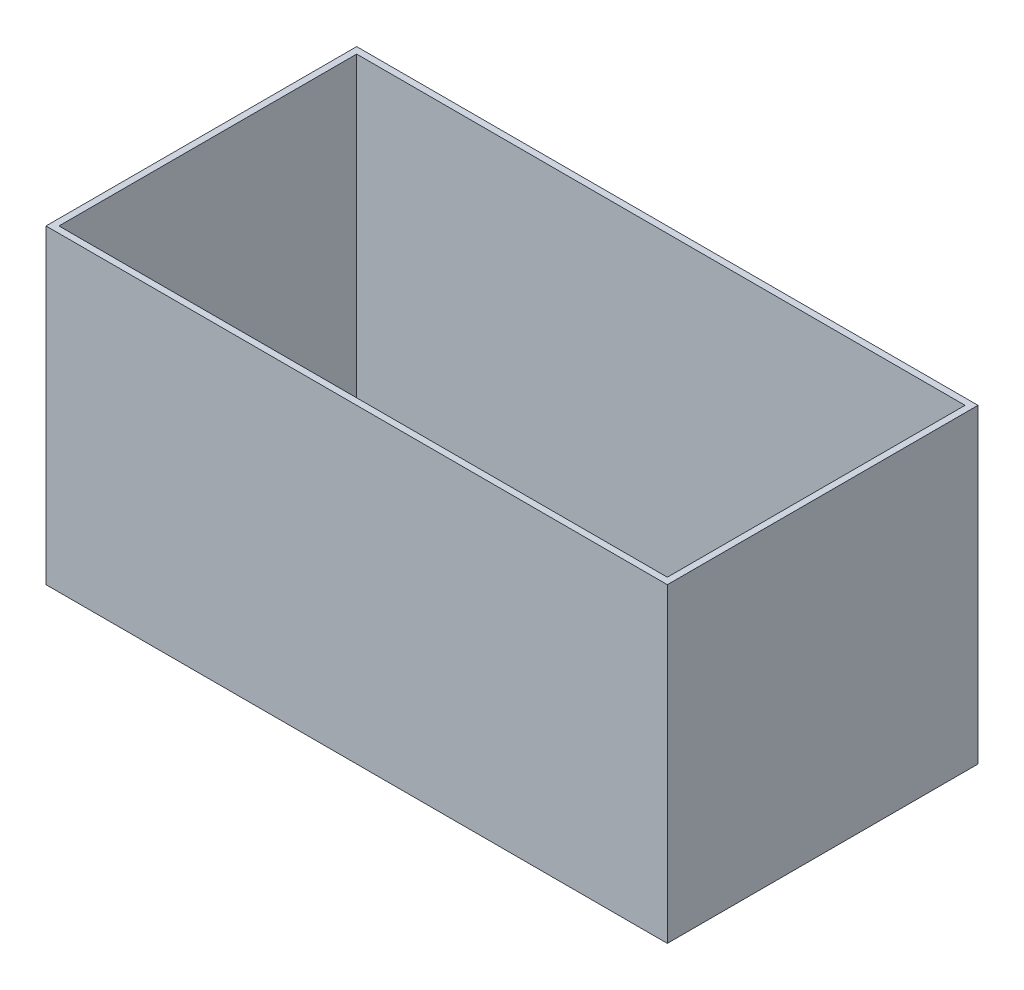
ISO-10303-21;
HEADER;
FILE_DESCRIPTION(('STEP AP214'),'2;1');
FILE_NAME('part.step','',(''),(''),'','','');
FILE_SCHEMA(('AUTOMOTIVE_DESIGN { 1 0 10303 214 1 1 1 1 }'));
ENDSEC;
DATA;
#1=APPLICATION_CONTEXT('core data for automotive mechanical design processes');
#2=APPLICATION_PROTOCOL_DEFINITION('international standard','automotive_design',2000,#1);
#3=PRODUCT_CONTEXT('',#1,'mechanical');
#4=PRODUCT('Part','Part','',(#3));
#5=PRODUCT_RELATED_PRODUCT_CATEGORY('part','',(#4));
#6=PRODUCT_DEFINITION_FORMATION('','',#4);
#7=PRODUCT_DEFINITION_CONTEXT('part definition',#1,'design');
#8=PRODUCT_DEFINITION('design','',#6,#7);
#9=PRODUCT_DEFINITION_SHAPE('','',#8);
#10=(LENGTH_UNIT() NAMED_UNIT(*) SI_UNIT(.MILLI.,.METRE.));
#11=(NAMED_UNIT(*) PLANE_ANGLE_UNIT() SI_UNIT($,.RADIAN.));
#12=(NAMED_UNIT(*) SI_UNIT($,.STERADIAN.) SOLID_ANGLE_UNIT());
#13=UNCERTAINTY_MEASURE_WITH_UNIT(LENGTH_MEASURE(1.E-05),#10,'distance_accuracy_value','');
#14=(GEOMETRIC_REPRESENTATION_CONTEXT(3) GLOBAL_UNCERTAINTY_ASSIGNED_CONTEXT((#13)) GLOBAL_UNIT_ASSIGNED_CONTEXT((#10,
#11,#12)) REPRESENTATION_CONTEXT('',''));
#15=CARTESIAN_POINT('',(0.,0.,0.));
#16=DIRECTION('',(0.,0.,1.));
#17=DIRECTION('',(1.,0.,0.));
#18=AXIS2_PLACEMENT_3D('',#15,#16,#17);
#19=CARTESIAN_POINT('',(0.,304.8,0.));
#20=DIRECTION('',(0.,-1.,0.));
#21=DIRECTION('',(0.,0.,-1.));
#22=AXIS2_PLACEMENT_3D('',#19,#20,#21);
#23=PLANE('',#22);
#24=DIRECTION('',(0.,0.,1.));
#25=VECTOR('',#24,1.);
#26=CARTESIAN_POINT('',(0.,304.8,0.));
#27=LINE('',#26,#25);
#28=CARTESIAN_POINT('',(0.,304.8,-304.8));
#29=VERTEX_POINT('',#28);
#30=CARTESIAN_POINT('',(0.,304.8,0.));
#31=VERTEX_POINT('',#30);
#32=EDGE_CURVE('E156',#29,#31,#27,.T.);
#33=ORIENTED_EDGE('',*,*,#32,.T.);
#34=DIRECTION('',(1.,0.,0.));
#35=VECTOR('',#34,1.);
#36=CARTESIAN_POINT('',(0.,304.8,0.));
#37=LINE('',#36,#35);
#38=CARTESIAN_POINT('',(609.6,304.8,0.));
#39=VERTEX_POINT('',#38);
#40=EDGE_CURVE('E98',#31,#39,#37,.T.);
#41=ORIENTED_EDGE('',*,*,#40,.T.);
#42=DIRECTION('',(0.,0.,-1.));
#43=VECTOR('',#42,1.);
#44=CARTESIAN_POINT('',(609.6,304.8,0.));
#45=LINE('',#44,#43);
#46=CARTESIAN_POINT('',(609.6,304.8,-304.8));
#47=VERTEX_POINT('',#46);
#48=EDGE_CURVE('E161',#39,#47,#45,.T.);
#49=ORIENTED_EDGE('',*,*,#48,.T.);
#50=DIRECTION('',(-1.,0.,0.));
#51=VECTOR('',#50,1.);
#52=CARTESIAN_POINT('',(0.,304.8,-304.8));
#53=LINE('',#52,#51);
#54=EDGE_CURVE('E70',#47,#29,#53,.T.);
#55=ORIENTED_EDGE('',*,*,#54,.T.);
#56=EDGE_LOOP('',(#33,#41,#49,#55));
#57=FACE_BOUND('',#56,.T.);
#58=DIRECTION('',(0.,0.,-1.));
#59=VECTOR('',#58,1.);
#60=CARTESIAN_POINT('',(6.35000000000005,304.8,-6.34999999999998));
#61=LINE('',#60,#59);
#62=CARTESIAN_POINT('',(6.35000000000005,304.8,-6.34999999999998));
#63=VERTEX_POINT('',#62);
#64=CARTESIAN_POINT('',(6.35000000000005,304.8,-298.45));
#65=VERTEX_POINT('',#64);
#66=EDGE_CURVE('E61',#63,#65,#61,.T.);
#67=ORIENTED_EDGE('',*,*,#66,.T.);
#68=DIRECTION('',(1.,0.,0.));
#69=VECTOR('',#68,1.);
#70=CARTESIAN_POINT('',(6.35000000000005,304.8,-298.45));
#71=LINE('',#70,#69);
#72=CARTESIAN_POINT('',(603.25,304.8,-298.45));
#73=VERTEX_POINT('',#72);
#74=EDGE_CURVE('E142',#65,#73,#71,.T.);
#75=ORIENTED_EDGE('',*,*,#74,.T.);
#76=DIRECTION('',(0.,0.,-1.));
#77=VECTOR('',#76,1.);
#78=CARTESIAN_POINT('',(603.25,304.8,-6.34999999999998));
#79=LINE('',#78,#77);
#80=CARTESIAN_POINT('',(603.25,304.8,-6.34999999999998));
#81=VERTEX_POINT('',#80);
#82=EDGE_CURVE('E288',#81,#73,#79,.T.);
#83=ORIENTED_EDGE('',*,*,#82,.F.);
#84=DIRECTION('',(1.,0.,0.));
#85=VECTOR('',#84,1.);
#86=CARTESIAN_POINT('',(6.35000000000005,304.8,-6.34999999999998));
#87=LINE('',#86,#85);
#88=EDGE_CURVE('E138',#63,#81,#87,.T.);
#89=ORIENTED_EDGE('',*,*,#88,.F.);
#90=EDGE_LOOP('',(#67,#75,#83,#89));
#91=FACE_BOUND('',#90,.T.);
#92=ADVANCED_FACE('F45',(#57,#91),#23,.F.);
#93=CARTESIAN_POINT('',(0.,304.8,0.));
#94=DIRECTION('',(1.,0.,0.));
#95=DIRECTION('',(0.,0.,-1.));
#96=AXIS2_PLACEMENT_3D('',#93,#94,#95);
#97=PLANE('',#96);
#98=DIRECTION('',(0.,0.,1.));
#99=VECTOR('',#98,1.);
#100=CARTESIAN_POINT('',(0.,0.,0.));
#101=LINE('',#100,#99);
#102=CARTESIAN_POINT('',(0.,0.,-304.8));
#103=VERTEX_POINT('',#102);
#104=CARTESIAN_POINT('',(0.,0.,0.));
#105=VERTEX_POINT('',#104);
#106=EDGE_CURVE('E144',#103,#105,#101,.T.);
#107=ORIENTED_EDGE('',*,*,#106,.T.);
#108=DIRECTION('',(0.,-1.,0.));
#109=VECTOR('',#108,1.);
#110=CARTESIAN_POINT('',(0.,304.8,0.));
#111=LINE('',#110,#109);
#112=EDGE_CURVE('E11',#31,#105,#111,.T.);
#113=ORIENTED_EDGE('',*,*,#112,.F.);
#114=ORIENTED_EDGE('',*,*,#32,.F.);
#115=DIRECTION('',(0.,-1.,0.));
#116=VECTOR('',#115,1.);
#117=CARTESIAN_POINT('',(0.,304.8,-304.8));
#118=LINE('',#117,#116);
#119=EDGE_CURVE('E165',#29,#103,#118,.T.);
#120=ORIENTED_EDGE('',*,*,#119,.T.);
#121=EDGE_LOOP('',(#107,#113,#114,#120));
#122=FACE_BOUND('',#121,.T.);
#123=ADVANCED_FACE('F47',(#122),#97,.F.);
#124=CARTESIAN_POINT('',(0.,304.8,0.));
#125=DIRECTION('',(0.,0.,-1.));
#126=DIRECTION('',(-1.,0.,0.));
#127=AXIS2_PLACEMENT_3D('',#124,#125,#126);
#128=PLANE('',#127);
#129=DIRECTION('',(1.,0.,0.));
#130=VECTOR('',#129,1.);
#131=CARTESIAN_POINT('',(0.,0.,0.));
#132=LINE('',#131,#130);
#133=CARTESIAN_POINT('',(609.6,0.,0.));
#134=VERTEX_POINT('',#133);
#135=EDGE_CURVE('E150',#105,#134,#132,.T.);
#136=ORIENTED_EDGE('',*,*,#135,.T.);
#137=DIRECTION('',(0.,-1.,0.));
#138=VECTOR('',#137,1.);
#139=CARTESIAN_POINT('',(609.6,304.8,0.));
#140=LINE('',#139,#138);
#141=EDGE_CURVE('E54',#39,#134,#140,.T.);
#142=ORIENTED_EDGE('',*,*,#141,.F.);
#143=ORIENTED_EDGE('',*,*,#40,.F.);
#144=ORIENTED_EDGE('',*,*,#112,.T.);
#145=EDGE_LOOP('',(#136,#142,#143,#144));
#146=FACE_BOUND('',#145,.T.);
#147=ADVANCED_FACE('F199',(#146),#128,.F.);
#148=CARTESIAN_POINT('',(609.6,304.8,0.));
#149=DIRECTION('',(-1.,0.,0.));
#150=DIRECTION('',(0.,0.,1.));
#151=AXIS2_PLACEMENT_3D('',#148,#149,#150);
#152=PLANE('',#151);
#153=DIRECTION('',(0.,0.,-1.));
#154=VECTOR('',#153,1.);
#155=CARTESIAN_POINT('',(609.6,0.,0.));
#156=LINE('',#155,#154);
#157=CARTESIAN_POINT('',(609.6,0.,-304.8));
#158=VERTEX_POINT('',#157);
#159=EDGE_CURVE('E169',#134,#158,#156,.T.);
#160=ORIENTED_EDGE('',*,*,#159,.T.);
#161=DIRECTION('',(0.,-1.,0.));
#162=VECTOR('',#161,1.);
#163=CARTESIAN_POINT('',(609.6,304.8,-304.8));
#164=LINE('',#163,#162);
#165=EDGE_CURVE('E176',#47,#158,#164,.T.);
#166=ORIENTED_EDGE('',*,*,#165,.F.);
#167=ORIENTED_EDGE('',*,*,#48,.F.);
#168=ORIENTED_EDGE('',*,*,#141,.T.);
#169=EDGE_LOOP('',(#160,#166,#167,#168));
#170=FACE_BOUND('',#169,.T.);
#171=ADVANCED_FACE('F183',(#170),#152,.F.);
#172=CARTESIAN_POINT('',(0.,304.8,-304.8));
#173=DIRECTION('',(0.,0.,1.));
#174=DIRECTION('',(1.,0.,0.));
#175=AXIS2_PLACEMENT_3D('',#172,#173,#174);
#176=PLANE('',#175);
#177=DIRECTION('',(-1.,0.,0.));
#178=VECTOR('',#177,1.);
#179=CARTESIAN_POINT('',(0.,0.,-304.8));
#180=LINE('',#179,#178);
#181=EDGE_CURVE('E91',#158,#103,#180,.T.);
#182=ORIENTED_EDGE('',*,*,#181,.T.);
#183=ORIENTED_EDGE('',*,*,#119,.F.);
#184=ORIENTED_EDGE('',*,*,#54,.F.);
#185=ORIENTED_EDGE('',*,*,#165,.T.);
#186=EDGE_LOOP('',(#182,#183,#184,#185));
#187=FACE_BOUND('',#186,.T.);
#188=ADVANCED_FACE('F191',(#187),#176,.F.);
#189=CARTESIAN_POINT('',(0.,0.,0.));
#190=DIRECTION('',(0.,-1.,0.));
#191=DIRECTION('',(0.,0.,-1.));
#192=AXIS2_PLACEMENT_3D('',#189,#190,#191);
#193=PLANE('',#192);
#194=ORIENTED_EDGE('',*,*,#106,.F.);
#195=ORIENTED_EDGE('',*,*,#181,.F.);
#196=ORIENTED_EDGE('',*,*,#159,.F.);
#197=ORIENTED_EDGE('',*,*,#135,.F.);
#198=EDGE_LOOP('',(#194,#195,#196,#197));
#199=FACE_BOUND('',#198,.T.);
#200=ADVANCED_FACE('F187',(#199),#193,.T.);
#201=CARTESIAN_POINT('',(6.35000000000005,6.35000000000002,-6.34999999999998));
#202=DIRECTION('',(1.,0.,0.));
#203=DIRECTION('',(0.,0.,-1.));
#204=AXIS2_PLACEMENT_3D('',#201,#202,#203);
#205=PLANE('',#204);
#206=ORIENTED_EDGE('',*,*,#66,.F.);
#207=DIRECTION('',(0.,1.,0.));
#208=VECTOR('',#207,1.);
#209=CARTESIAN_POINT('',(6.35000000000005,6.35000000000002,-6.34999999999998));
#210=LINE('',#209,#208);
#211=CARTESIAN_POINT('',(6.35000000000005,6.35000000000002,-6.34999999999998));
#212=VERTEX_POINT('',#211);
#213=EDGE_CURVE('E136',#212,#63,#210,.T.);
#214=ORIENTED_EDGE('',*,*,#213,.F.);
#215=DIRECTION('',(0.,0.,-1.));
#216=VECTOR('',#215,1.);
#217=CARTESIAN_POINT('',(6.35000000000005,6.35000000000002,-6.34999999999998));
#218=LINE('',#217,#216);
#219=CARTESIAN_POINT('',(6.35000000000005,6.35000000000002,-298.45));
#220=VERTEX_POINT('',#219);
#221=EDGE_CURVE('E125',#212,#220,#218,.T.);
#222=ORIENTED_EDGE('',*,*,#221,.T.);
#223=DIRECTION('',(0.,1.,0.));
#224=VECTOR('',#223,1.);
#225=CARTESIAN_POINT('',(6.35000000000005,6.35000000000002,-298.45));
#226=LINE('',#225,#224);
#227=EDGE_CURVE('E135',#220,#65,#226,.T.);
#228=ORIENTED_EDGE('',*,*,#227,.T.);
#229=EDGE_LOOP('',(#206,#214,#222,#228));
#230=FACE_BOUND('',#229,.T.);
#231=ADVANCED_FACE('F134',(#230),#205,.T.);
#232=CARTESIAN_POINT('',(6.35000000000005,6.35000000000002,-298.45));
#233=DIRECTION('',(0.,0.,1.));
#234=DIRECTION('',(1.,0.,0.));
#235=AXIS2_PLACEMENT_3D('',#232,#233,#234);
#236=PLANE('',#235);
#237=ORIENTED_EDGE('',*,*,#74,.F.);
#238=ORIENTED_EDGE('',*,*,#227,.F.);
#239=DIRECTION('',(1.,0.,0.));
#240=VECTOR('',#239,1.);
#241=CARTESIAN_POINT('',(6.35000000000005,6.35000000000002,-298.45));
#242=LINE('',#241,#240);
#243=CARTESIAN_POINT('',(603.25,6.35000000000002,-298.45));
#244=VERTEX_POINT('',#243);
#245=EDGE_CURVE('E121',#220,#244,#242,.T.);
#246=ORIENTED_EDGE('',*,*,#245,.T.);
#247=DIRECTION('',(0.,1.,0.));
#248=VECTOR('',#247,1.);
#249=CARTESIAN_POINT('',(603.25,6.35000000000002,-298.45));
#250=LINE('',#249,#248);
#251=EDGE_CURVE('E145',#244,#73,#250,.T.);
#252=ORIENTED_EDGE('',*,*,#251,.T.);
#253=EDGE_LOOP('',(#237,#238,#246,#252));
#254=FACE_BOUND('',#253,.T.);
#255=ADVANCED_FACE('F140',(#254),#236,.T.);
#256=CARTESIAN_POINT('',(603.25,6.35000000000002,-6.34999999999998));
#257=DIRECTION('',(1.,0.,0.));
#258=DIRECTION('',(0.,0.,-1.));
#259=AXIS2_PLACEMENT_3D('',#256,#257,#258);
#260=PLANE('',#259);
#261=ORIENTED_EDGE('',*,*,#82,.T.);
#262=ORIENTED_EDGE('',*,*,#251,.F.);
#263=DIRECTION('',(0.,0.,-1.));
#264=VECTOR('',#263,1.);
#265=CARTESIAN_POINT('',(603.25,6.35000000000002,-6.34999999999998));
#266=LINE('',#265,#264);
#267=CARTESIAN_POINT('',(603.25,6.35000000000002,-6.34999999999998));
#268=VERTEX_POINT('',#267);
#269=EDGE_CURVE('E128',#268,#244,#266,.T.);
#270=ORIENTED_EDGE('',*,*,#269,.F.);
#271=DIRECTION('',(0.,1.,0.));
#272=VECTOR('',#271,1.);
#273=CARTESIAN_POINT('',(603.25,6.35000000000002,-6.34999999999998));
#274=LINE('',#273,#272);
#275=EDGE_CURVE('E152',#268,#81,#274,.T.);
#276=ORIENTED_EDGE('',*,*,#275,.T.);
#277=EDGE_LOOP('',(#261,#262,#270,#276));
#278=FACE_BOUND('',#277,.T.);
#279=ADVANCED_FACE('F212',(#278),#260,.F.);
#280=CARTESIAN_POINT('',(6.35000000000005,6.35000000000002,-6.34999999999998));
#281=DIRECTION('',(0.,0.,1.));
#282=DIRECTION('',(1.,0.,0.));
#283=AXIS2_PLACEMENT_3D('',#280,#281,#282);
#284=PLANE('',#283);
#285=ORIENTED_EDGE('',*,*,#88,.T.);
#286=ORIENTED_EDGE('',*,*,#275,.F.);
#287=DIRECTION('',(1.,0.,0.));
#288=VECTOR('',#287,1.);
#289=CARTESIAN_POINT('',(6.35000000000005,6.35000000000002,-6.34999999999998));
#290=LINE('',#289,#288);
#291=EDGE_CURVE('E298',#212,#268,#290,.T.);
#292=ORIENTED_EDGE('',*,*,#291,.F.);
#293=ORIENTED_EDGE('',*,*,#213,.T.);
#294=EDGE_LOOP('',(#285,#286,#292,#293));
#295=FACE_BOUND('',#294,.T.);
#296=ADVANCED_FACE('F215',(#295),#284,.F.);
#297=CARTESIAN_POINT('',(0.,6.35000000000002,0.));
#298=DIRECTION('',(0.,-1.,0.));
#299=DIRECTION('',(0.,0.,-1.));
#300=AXIS2_PLACEMENT_3D('',#297,#298,#299);
#301=PLANE('',#300);
#302=ORIENTED_EDGE('',*,*,#221,.F.);
#303=ORIENTED_EDGE('',*,*,#291,.T.);
#304=ORIENTED_EDGE('',*,*,#269,.T.);
#305=ORIENTED_EDGE('',*,*,#245,.F.);
#306=EDGE_LOOP('',(#302,#303,#304,#305));
#307=FACE_BOUND('',#306,.T.);
#308=ADVANCED_FACE('F123',(#307),#301,.F.);
#309=CLOSED_SHELL('',(#92,#123,#147,#171,#188,#200,#231,#255,#279,#296,#308));
#310=MANIFOLD_SOLID_BREP('B2',#309);
#311=ADVANCED_BREP_SHAPE_REPRESENTATION('',(#18,#310),#14);
#312=SHAPE_DEFINITION_REPRESENTATION(#9,#311);
ENDSEC;
END-ISO-10303-21;
